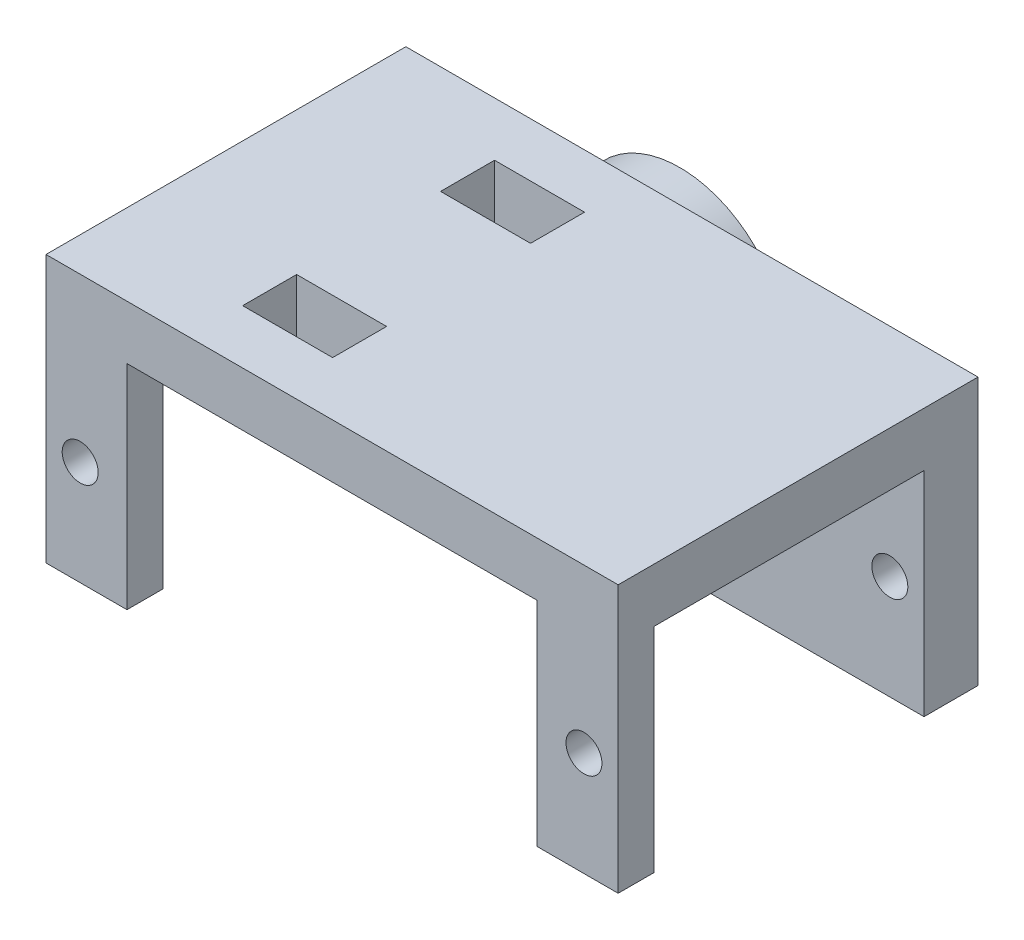
ISO-10303-21;
HEADER;
FILE_DESCRIPTION(('STEP AP214'),'2;1');
FILE_NAME('part.step','',(''),(''),'','','');
FILE_SCHEMA(('AUTOMOTIVE_DESIGN { 1 0 10303 214 1 1 1 1 }'));
ENDSEC;
DATA;
#1=APPLICATION_CONTEXT('core data for automotive mechanical design processes');
#2=APPLICATION_PROTOCOL_DEFINITION('international standard','automotive_design',2000,#1);
#3=PRODUCT_CONTEXT('',#1,'mechanical');
#4=PRODUCT('Part','Part','',(#3));
#5=PRODUCT_RELATED_PRODUCT_CATEGORY('part','',(#4));
#6=PRODUCT_DEFINITION_FORMATION('','',#4);
#7=PRODUCT_DEFINITION_CONTEXT('part definition',#1,'design');
#8=PRODUCT_DEFINITION('design','',#6,#7);
#9=PRODUCT_DEFINITION_SHAPE('','',#8);
#10=(LENGTH_UNIT() NAMED_UNIT(*) SI_UNIT(.MILLI.,.METRE.));
#11=(NAMED_UNIT(*) PLANE_ANGLE_UNIT() SI_UNIT($,.RADIAN.));
#12=(NAMED_UNIT(*) SI_UNIT($,.STERADIAN.) SOLID_ANGLE_UNIT());
#13=UNCERTAINTY_MEASURE_WITH_UNIT(LENGTH_MEASURE(1.E-05),#10,'distance_accuracy_value','');
#14=(GEOMETRIC_REPRESENTATION_CONTEXT(3) GLOBAL_UNCERTAINTY_ASSIGNED_CONTEXT((#13)) GLOBAL_UNIT_ASSIGNED_CONTEXT((#10,
#11,#12)) REPRESENTATION_CONTEXT('',''));
#15=CARTESIAN_POINT('',(0.,0.,0.));
#16=DIRECTION('',(0.,0.,1.));
#17=DIRECTION('',(1.,0.,0.));
#18=AXIS2_PLACEMENT_3D('',#15,#16,#17);
#19=CARTESIAN_POINT('',(14.,0.574999999999999,-18.4));
#20=DIRECTION('',(0.,0.,1.));
#21=DIRECTION('',(1.,0.,0.));
#22=AXIS2_PLACEMENT_3D('',#19,#20,#21);
#23=CYLINDRICAL_SURFACE('',#22,1.);
#24=CARTESIAN_POINT('',(14.,0.574999999999999,-15.4));
#25=DIRECTION('',(0.,0.,1.));
#26=DIRECTION('',(1.,0.,0.));
#27=AXIS2_PLACEMENT_3D('',#24,#25,#26);
#28=CIRCLE('',#27,1.);
#29=CARTESIAN_POINT('',(15.,0.574999999999999,-15.4));
#30=VERTEX_POINT('',#29);
#31=EDGE_CURVE('E265',#30,#30,#28,.T.);
#32=ORIENTED_EDGE('',*,*,#31,.T.);
#33=EDGE_LOOP('',(#32));
#34=FACE_BOUND('',#33,.T.);
#35=CARTESIAN_POINT('',(14.,0.574999999999999,-18.4));
#36=DIRECTION('',(0.,0.,1.));
#37=DIRECTION('',(-1.,0.,0.));
#38=AXIS2_PLACEMENT_3D('',#35,#36,#37);
#39=CIRCLE('',#38,1.);
#40=CARTESIAN_POINT('',(13.,0.574999999999999,-18.4));
#41=VERTEX_POINT('',#40);
#42=EDGE_CURVE('E258',#41,#41,#39,.T.);
#43=ORIENTED_EDGE('',*,*,#42,.F.);
#44=EDGE_LOOP('',(#43));
#45=FACE_BOUND('',#44,.T.);
#46=ADVANCED_FACE('F36',(#34,#45),#23,.F.);
#47=CARTESIAN_POINT('',(11.4,0.,0.));
#48=DIRECTION('',(1.,0.,0.));
#49=DIRECTION('',(0.,0.,-1.));
#50=AXIS2_PLACEMENT_3D('',#47,#48,#49);
#51=PLANE('',#50);
#52=DIRECTION('',(0.,-1.,0.));
#53=VECTOR('',#52,1.);
#54=CARTESIAN_POINT('',(11.4,0.,-0.4));
#55=LINE('',#54,#53);
#56=CARTESIAN_POINT('',(11.4,6.625,-0.400000000000001));
#57=VERTEX_POINT('',#56);
#58=CARTESIAN_POINT('',(11.4,-5.225,-0.4));
#59=VERTEX_POINT('',#58);
#60=EDGE_CURVE('E313',#57,#59,#55,.T.);
#61=ORIENTED_EDGE('',*,*,#60,.T.);
#62=DIRECTION('',(0.,0.,1.));
#63=VECTOR('',#62,1.);
#64=CARTESIAN_POINT('',(11.4,-5.225,0.));
#65=LINE('',#64,#63);
#66=CARTESIAN_POINT('',(11.4,-5.225,1.6));
#67=VERTEX_POINT('',#66);
#68=EDGE_CURVE('E277',#59,#67,#65,.T.);
#69=ORIENTED_EDGE('',*,*,#68,.T.);
#70=DIRECTION('',(0.,1.,0.));
#71=VECTOR('',#70,1.);
#72=CARTESIAN_POINT('',(11.4,0.,1.6));
#73=LINE('',#72,#71);
#74=CARTESIAN_POINT('',(11.4,6.625,1.6));
#75=VERTEX_POINT('',#74);
#76=EDGE_CURVE('E303',#67,#75,#73,.T.);
#77=ORIENTED_EDGE('',*,*,#76,.T.);
#78=DIRECTION('',(0.,0.,1.));
#79=VECTOR('',#78,1.);
#80=CARTESIAN_POINT('',(11.4,6.625,0.));
#81=LINE('',#80,#79);
#82=EDGE_CURVE('E331',#57,#75,#81,.T.);
#83=ORIENTED_EDGE('',*,*,#82,.F.);
#84=EDGE_LOOP('',(#61,#69,#77,#83));
#85=FACE_BOUND('',#84,.T.);
#86=ADVANCED_FACE('F416',(#85),#51,.F.);
#87=CARTESIAN_POINT('',(-15.9,6.625,-21.));
#88=DIRECTION('',(0.,-1.,0.));
#89=DIRECTION('',(0.,0.,-1.));
#90=AXIS2_PLACEMENT_3D('',#87,#88,#89);
#91=PLANE('',#90);
#92=DIRECTION('',(0.,0.,1.));
#93=VECTOR('',#92,1.);
#94=CARTESIAN_POINT('',(-2.97000000000001,6.625,-15.4));
#95=LINE('',#94,#93);
#96=CARTESIAN_POINT('',(-2.97000000000001,6.625,-15.4));
#97=VERTEX_POINT('',#96);
#98=CARTESIAN_POINT('',(-2.97000000000001,6.625,-12.4));
#99=VERTEX_POINT('',#98);
#100=EDGE_CURVE('E187',#97,#99,#95,.T.);
#101=ORIENTED_EDGE('',*,*,#100,.F.);
#102=DIRECTION('',(-1.,0.,0.));
#103=VECTOR('',#102,1.);
#104=CARTESIAN_POINT('',(0.,6.625,-15.4));
#105=LINE('',#104,#103);
#106=CARTESIAN_POINT('',(15.9,6.625,-15.4));
#107=VERTEX_POINT('',#106);
#108=EDGE_CURVE('E329',#107,#97,#105,.T.);
#109=ORIENTED_EDGE('',*,*,#108,.F.);
#110=DIRECTION('',(0.,0.,1.));
#111=VECTOR('',#110,1.);
#112=CARTESIAN_POINT('',(15.9,6.625,-21.));
#113=LINE('',#112,#111);
#114=CARTESIAN_POINT('',(15.9,6.625,-0.400000000000001));
#115=VERTEX_POINT('',#114);
#116=EDGE_CURVE('E344',#107,#115,#113,.T.);
#117=ORIENTED_EDGE('',*,*,#116,.T.);
#118=DIRECTION('',(-1.,0.,0.));
#119=VECTOR('',#118,1.);
#120=CARTESIAN_POINT('',(84.1,6.625,-0.400000000000001));
#121=LINE('',#120,#119);
#122=EDGE_CURVE('E294',#115,#57,#121,.T.);
#123=ORIENTED_EDGE('',*,*,#122,.T.);
#124=ORIENTED_EDGE('',*,*,#82,.T.);
#125=DIRECTION('',(1.,0.,0.));
#126=VECTOR('',#125,1.);
#127=CARTESIAN_POINT('',(-15.9,6.625,1.6));
#128=LINE('',#127,#126);
#129=CARTESIAN_POINT('',(-11.4,6.625,1.6));
#130=VERTEX_POINT('',#129);
#131=EDGE_CURVE('E300',#130,#75,#128,.T.);
#132=ORIENTED_EDGE('',*,*,#131,.F.);
#133=DIRECTION('',(0.,0.,1.));
#134=VECTOR('',#133,1.);
#135=CARTESIAN_POINT('',(-11.4,6.625,0.));
#136=LINE('',#135,#134);
#137=CARTESIAN_POINT('',(-11.4,6.625,-0.400000000000001));
#138=VERTEX_POINT('',#137);
#139=EDGE_CURVE('E332',#138,#130,#136,.T.);
#140=ORIENTED_EDGE('',*,*,#139,.F.);
#141=CARTESIAN_POINT('',(-15.9,6.625,-0.400000000000001));
#142=VERTEX_POINT('',#141);
#143=EDGE_CURVE('E290',#138,#142,#121,.T.);
#144=ORIENTED_EDGE('',*,*,#143,.T.);
#145=DIRECTION('',(0.,0.,1.));
#146=VECTOR('',#145,1.);
#147=CARTESIAN_POINT('',(-15.9,6.625,-21.));
#148=LINE('',#147,#146);
#149=CARTESIAN_POINT('',(-15.9,6.625,-15.4));
#150=VERTEX_POINT('',#149);
#151=EDGE_CURVE('E335',#150,#142,#148,.T.);
#152=ORIENTED_EDGE('',*,*,#151,.F.);
#153=CARTESIAN_POINT('',(-7.97000000000001,6.625,-15.4));
#154=VERTEX_POINT('',#153);
#155=EDGE_CURVE('E328',#154,#150,#105,.T.);
#156=ORIENTED_EDGE('',*,*,#155,.F.);
#157=DIRECTION('',(0.,0.,-1.));
#158=VECTOR('',#157,1.);
#159=CARTESIAN_POINT('',(-7.97000000000001,6.625,-15.4));
#160=LINE('',#159,#158);
#161=CARTESIAN_POINT('',(-7.97000000000001,6.625,-12.4));
#162=VERTEX_POINT('',#161);
#163=EDGE_CURVE('E184',#162,#154,#160,.T.);
#164=ORIENTED_EDGE('',*,*,#163,.F.);
#165=DIRECTION('',(-1.,0.,0.));
#166=VECTOR('',#165,1.);
#167=CARTESIAN_POINT('',(-7.97000000000001,6.625,-12.4));
#168=LINE('',#167,#166);
#169=EDGE_CURVE('E178',#99,#162,#168,.T.);
#170=ORIENTED_EDGE('',*,*,#169,.F.);
#171=EDGE_LOOP('',(#101,#109,#117,#123,#124,#132,#140,#144,#152,#156,#164,#170));
#172=FACE_BOUND('',#171,.T.);
#173=DIRECTION('',(0.,0.,1.));
#174=VECTOR('',#173,1.);
#175=CARTESIAN_POINT('',(-2.97,6.625,-4.4));
#176=LINE('',#175,#174);
#177=CARTESIAN_POINT('',(-2.97,6.625,-4.4));
#178=VERTEX_POINT('',#177);
#179=CARTESIAN_POINT('',(-2.97,6.625,-1.4));
#180=VERTEX_POINT('',#179);
#181=EDGE_CURVE('E51',#178,#180,#176,.T.);
#182=ORIENTED_EDGE('',*,*,#181,.F.);
#183=DIRECTION('',(1.,0.,0.));
#184=VECTOR('',#183,1.);
#185=CARTESIAN_POINT('',(-7.97000000000001,6.625,-4.4));
#186=LINE('',#185,#184);
#187=CARTESIAN_POINT('',(-7.97000000000001,6.625,-4.4));
#188=VERTEX_POINT('',#187);
#189=EDGE_CURVE('E215',#188,#178,#186,.T.);
#190=ORIENTED_EDGE('',*,*,#189,.F.);
#191=DIRECTION('',(0.,0.,-1.));
#192=VECTOR('',#191,1.);
#193=CARTESIAN_POINT('',(-7.97000000000001,6.625,-4.4));
#194=LINE('',#193,#192);
#195=CARTESIAN_POINT('',(-7.97000000000001,6.625,-1.4));
#196=VERTEX_POINT('',#195);
#197=EDGE_CURVE('E212',#196,#188,#194,.T.);
#198=ORIENTED_EDGE('',*,*,#197,.F.);
#199=DIRECTION('',(-1.,0.,0.));
#200=VECTOR('',#199,1.);
#201=CARTESIAN_POINT('',(-7.97000000000001,6.625,-1.4));
#202=LINE('',#201,#200);
#203=EDGE_CURVE('E209',#180,#196,#202,.T.);
#204=ORIENTED_EDGE('',*,*,#203,.F.);
#205=EDGE_LOOP('',(#182,#190,#198,#204));
#206=FACE_BOUND('',#205,.T.);
#207=ADVANCED_FACE('F196',(#172,#206),#91,.T.);
#208=CARTESIAN_POINT('',(-15.9,-6.625,3.));
#209=DIRECTION('',(1.,0.,0.));
#210=DIRECTION('',(0.,0.,-1.));
#211=AXIS2_PLACEMENT_3D('',#208,#209,#210);
#212=PLANE('',#211);
#213=DIRECTION('',(0.,1.,0.));
#214=VECTOR('',#213,1.);
#215=CARTESIAN_POINT('',(-15.9,-39.8161959700948,-18.4));
#216=LINE('',#215,#214);
#217=CARTESIAN_POINT('',(-15.9,-5.225,-18.4));
#218=VERTEX_POINT('',#217);
#219=CARTESIAN_POINT('',(-15.9,9.625,-18.4));
#220=VERTEX_POINT('',#219);
#221=EDGE_CURVE('E320',#218,#220,#216,.T.);
#222=ORIENTED_EDGE('',*,*,#221,.F.);
#223=DIRECTION('',(0.,0.,1.));
#224=VECTOR('',#223,1.);
#225=CARTESIAN_POINT('',(-15.9,-5.225,-18.4));
#226=LINE('',#225,#224);
#227=CARTESIAN_POINT('',(-15.9,-5.225,-15.4));
#228=VERTEX_POINT('',#227);
#229=EDGE_CURVE('E246',#218,#228,#226,.T.);
#230=ORIENTED_EDGE('',*,*,#229,.T.);
#231=DIRECTION('',(0.,1.,0.));
#232=VECTOR('',#231,1.);
#233=CARTESIAN_POINT('',(-15.9,-39.8161959700948,-15.4));
#234=LINE('',#233,#232);
#235=EDGE_CURVE('E322',#228,#150,#234,.T.);
#236=ORIENTED_EDGE('',*,*,#235,.T.);
#237=ORIENTED_EDGE('',*,*,#151,.T.);
#238=DIRECTION('',(0.,1.,0.));
#239=VECTOR('',#238,1.);
#240=CARTESIAN_POINT('',(-15.9,6.625,-0.400000000000001));
#241=LINE('',#240,#239);
#242=CARTESIAN_POINT('',(-15.9,-5.225,-0.400000000000001));
#243=VERTEX_POINT('',#242);
#244=EDGE_CURVE('E288',#243,#142,#241,.T.);
#245=ORIENTED_EDGE('',*,*,#244,.F.);
#246=CARTESIAN_POINT('',(-15.9,-5.225,1.6));
#247=VERTEX_POINT('',#246);
#248=EDGE_CURVE('E250',#243,#247,#226,.T.);
#249=ORIENTED_EDGE('',*,*,#248,.T.);
#250=DIRECTION('',(0.,-1.,0.));
#251=VECTOR('',#250,1.);
#252=CARTESIAN_POINT('',(-15.9,9.625,1.6));
#253=LINE('',#252,#251);
#254=CARTESIAN_POINT('',(-15.9,9.625,1.6));
#255=VERTEX_POINT('',#254);
#256=EDGE_CURVE('E287',#255,#247,#253,.T.);
#257=ORIENTED_EDGE('',*,*,#256,.F.);
#258=DIRECTION('',(0.,0.,1.));
#259=VECTOR('',#258,1.);
#260=CARTESIAN_POINT('',(-15.9,9.625,-21.));
#261=LINE('',#260,#259);
#262=EDGE_CURVE('E338',#220,#255,#261,.T.);
#263=ORIENTED_EDGE('',*,*,#262,.F.);
#264=EDGE_LOOP('',(#222,#230,#236,#237,#245,#249,#257,#263));
#265=FACE_BOUND('',#264,.T.);
#266=ADVANCED_FACE('F38',(#265),#212,.F.);
#267=CARTESIAN_POINT('',(15.9,-6.625,3.));
#268=DIRECTION('',(-1.,0.,0.));
#269=DIRECTION('',(0.,0.,1.));
#270=AXIS2_PLACEMENT_3D('',#267,#268,#269);
#271=PLANE('',#270);
#272=DIRECTION('',(0.,-1.,0.));
#273=VECTOR('',#272,1.);
#274=CARTESIAN_POINT('',(15.9,-6.625,1.6));
#275=LINE('',#274,#273);
#276=CARTESIAN_POINT('',(15.9,9.625,1.6));
#277=VERTEX_POINT('',#276);
#278=CARTESIAN_POINT('',(15.9,-5.225,1.6));
#279=VERTEX_POINT('',#278);
#280=EDGE_CURVE('E305',#277,#279,#275,.T.);
#281=ORIENTED_EDGE('',*,*,#280,.T.);
#282=DIRECTION('',(0.,0.,1.));
#283=VECTOR('',#282,1.);
#284=CARTESIAN_POINT('',(15.9,-5.225,-18.4));
#285=LINE('',#284,#283);
#286=CARTESIAN_POINT('',(15.9,-5.225,-0.400000000000001));
#287=VERTEX_POINT('',#286);
#288=EDGE_CURVE('E241',#287,#279,#285,.T.);
#289=ORIENTED_EDGE('',*,*,#288,.F.);
#290=DIRECTION('',(0.,1.,0.));
#291=VECTOR('',#290,1.);
#292=CARTESIAN_POINT('',(15.9,-6.625,-0.399999999999999));
#293=LINE('',#292,#291);
#294=EDGE_CURVE('E311',#287,#115,#293,.T.);
#295=ORIENTED_EDGE('',*,*,#294,.T.);
#296=ORIENTED_EDGE('',*,*,#116,.F.);
#297=DIRECTION('',(0.,1.,0.));
#298=VECTOR('',#297,1.);
#299=CARTESIAN_POINT('',(15.9,-39.8161959700948,-15.4));
#300=LINE('',#299,#298);
#301=CARTESIAN_POINT('',(15.9,-5.225,-15.4));
#302=VERTEX_POINT('',#301);
#303=EDGE_CURVE('E319',#302,#107,#300,.T.);
#304=ORIENTED_EDGE('',*,*,#303,.F.);
#305=CARTESIAN_POINT('',(15.9,-5.225,-18.4));
#306=VERTEX_POINT('',#305);
#307=EDGE_CURVE('E251',#306,#302,#285,.T.);
#308=ORIENTED_EDGE('',*,*,#307,.F.);
#309=DIRECTION('',(0.,1.,0.));
#310=VECTOR('',#309,1.);
#311=CARTESIAN_POINT('',(15.9,-39.8161959700948,-18.4));
#312=LINE('',#311,#310);
#313=CARTESIAN_POINT('',(15.9,9.625,-18.4));
#314=VERTEX_POINT('',#313);
#315=EDGE_CURVE('E323',#306,#314,#312,.T.);
#316=ORIENTED_EDGE('',*,*,#315,.T.);
#317=DIRECTION('',(0.,0.,1.));
#318=VECTOR('',#317,1.);
#319=CARTESIAN_POINT('',(15.9,9.625,-21.));
#320=LINE('',#319,#318);
#321=EDGE_CURVE('E341',#314,#277,#320,.T.);
#322=ORIENTED_EDGE('',*,*,#321,.T.);
#323=EDGE_LOOP('',(#281,#289,#295,#296,#304,#308,#316,#322));
#324=FACE_BOUND('',#323,.T.);
#325=ADVANCED_FACE('F375',(#324),#271,.F.);
#326=CARTESIAN_POINT('',(-15.9,9.625,-21.));
#327=DIRECTION('',(0.,1.,0.));
#328=DIRECTION('',(0.,0.,1.));
#329=AXIS2_PLACEMENT_3D('',#326,#327,#328);
#330=PLANE('',#329);
#331=DIRECTION('',(0.,0.,-1.));
#332=VECTOR('',#331,1.);
#333=CARTESIAN_POINT('',(-2.97000000000001,9.625,-21.));
#334=LINE('',#333,#332);
#335=CARTESIAN_POINT('',(-2.97000000000001,9.625,-12.4));
#336=VERTEX_POINT('',#335);
#337=CARTESIAN_POINT('',(-2.97000000000001,9.625,-15.4));
#338=VERTEX_POINT('',#337);
#339=EDGE_CURVE('E11',#336,#338,#334,.T.);
#340=ORIENTED_EDGE('',*,*,#339,.F.);
#341=DIRECTION('',(1.,0.,0.));
#342=VECTOR('',#341,1.);
#343=CARTESIAN_POINT('',(-15.9,9.625,-12.4));
#344=LINE('',#343,#342);
#345=CARTESIAN_POINT('',(-7.97000000000001,9.625,-12.4));
#346=VERTEX_POINT('',#345);
#347=EDGE_CURVE('E181',#346,#336,#344,.T.);
#348=ORIENTED_EDGE('',*,*,#347,.F.);
#349=DIRECTION('',(0.,0.,1.));
#350=VECTOR('',#349,1.);
#351=CARTESIAN_POINT('',(-7.97000000000001,9.625,-21.));
#352=LINE('',#351,#350);
#353=CARTESIAN_POINT('',(-7.97000000000001,9.625,-15.4));
#354=VERTEX_POINT('',#353);
#355=EDGE_CURVE('E360',#354,#346,#352,.T.);
#356=ORIENTED_EDGE('',*,*,#355,.F.);
#357=DIRECTION('',(-1.,0.,0.));
#358=VECTOR('',#357,1.);
#359=CARTESIAN_POINT('',(-15.9,9.625,-15.4));
#360=LINE('',#359,#358);
#361=EDGE_CURVE('E44',#338,#354,#360,.T.);
#362=ORIENTED_EDGE('',*,*,#361,.F.);
#363=EDGE_LOOP('',(#340,#348,#356,#362));
#364=FACE_BOUND('',#363,.T.);
#365=DIRECTION('',(0.,0.,-1.));
#366=VECTOR('',#365,1.);
#367=CARTESIAN_POINT('',(-2.97,9.625,-21.));
#368=LINE('',#367,#366);
#369=CARTESIAN_POINT('',(-2.97,9.625,-1.4));
#370=VERTEX_POINT('',#369);
#371=CARTESIAN_POINT('',(-2.97,9.625,-4.4));
#372=VERTEX_POINT('',#371);
#373=EDGE_CURVE('E357',#370,#372,#368,.T.);
#374=ORIENTED_EDGE('',*,*,#373,.F.);
#375=DIRECTION('',(1.,0.,0.));
#376=VECTOR('',#375,1.);
#377=CARTESIAN_POINT('',(-15.9,9.625,-1.4));
#378=LINE('',#377,#376);
#379=CARTESIAN_POINT('',(-7.97000000000001,9.625,-1.4));
#380=VERTEX_POINT('',#379);
#381=EDGE_CURVE('E231',#380,#370,#378,.T.);
#382=ORIENTED_EDGE('',*,*,#381,.F.);
#383=DIRECTION('',(0.,0.,1.));
#384=VECTOR('',#383,1.);
#385=CARTESIAN_POINT('',(-7.97000000000001,9.625,-21.));
#386=LINE('',#385,#384);
#387=CARTESIAN_POINT('',(-7.97000000000001,9.625,-4.4));
#388=VERTEX_POINT('',#387);
#389=EDGE_CURVE('E352',#388,#380,#386,.T.);
#390=ORIENTED_EDGE('',*,*,#389,.F.);
#391=DIRECTION('',(-1.,0.,0.));
#392=VECTOR('',#391,1.);
#393=CARTESIAN_POINT('',(-15.9,9.625,-4.4));
#394=LINE('',#393,#392);
#395=EDGE_CURVE('E355',#372,#388,#394,.T.);
#396=ORIENTED_EDGE('',*,*,#395,.F.);
#397=EDGE_LOOP('',(#374,#382,#390,#396));
#398=FACE_BOUND('',#397,.T.);
#399=DIRECTION('',(-1.,0.,0.));
#400=VECTOR('',#399,1.);
#401=CARTESIAN_POINT('',(84.1,9.625,1.6));
#402=LINE('',#401,#400);
#403=EDGE_CURVE('E291',#277,#255,#402,.T.);
#404=ORIENTED_EDGE('',*,*,#403,.F.);
#405=ORIENTED_EDGE('',*,*,#321,.F.);
#406=DIRECTION('',(-1.,0.,0.));
#407=VECTOR('',#406,1.);
#408=CARTESIAN_POINT('',(-15.9,9.625,-18.4));
#409=LINE('',#408,#407);
#410=EDGE_CURVE('E316',#314,#220,#409,.T.);
#411=ORIENTED_EDGE('',*,*,#410,.T.);
#412=ORIENTED_EDGE('',*,*,#262,.T.);
#413=EDGE_LOOP('',(#404,#405,#411,#412));
#414=FACE_BOUND('',#413,.T.);
#415=ADVANCED_FACE('F371',(#364,#398,#414),#330,.T.);
#416=CARTESIAN_POINT('',(-11.4,0.,0.));
#417=DIRECTION('',(1.,0.,0.));
#418=DIRECTION('',(0.,0.,-1.));
#419=AXIS2_PLACEMENT_3D('',#416,#417,#418);
#420=PLANE('',#419);
#421=DIRECTION('',(0.,0.,1.));
#422=VECTOR('',#421,1.);
#423=CARTESIAN_POINT('',(-11.4,-5.225,0.));
#424=LINE('',#423,#422);
#425=CARTESIAN_POINT('',(-11.4,-5.225,-0.4));
#426=VERTEX_POINT('',#425);
#427=CARTESIAN_POINT('',(-11.4,-5.225,1.6));
#428=VERTEX_POINT('',#427);
#429=EDGE_CURVE('E283',#426,#428,#424,.T.);
#430=ORIENTED_EDGE('',*,*,#429,.F.);
#431=DIRECTION('',(0.,-1.,0.));
#432=VECTOR('',#431,1.);
#433=CARTESIAN_POINT('',(-11.4,0.,-0.4));
#434=LINE('',#433,#432);
#435=EDGE_CURVE('E308',#138,#426,#434,.T.);
#436=ORIENTED_EDGE('',*,*,#435,.F.);
#437=ORIENTED_EDGE('',*,*,#139,.T.);
#438=DIRECTION('',(0.,1.,0.));
#439=VECTOR('',#438,1.);
#440=CARTESIAN_POINT('',(-11.4,0.,1.6));
#441=LINE('',#440,#439);
#442=EDGE_CURVE('E298',#428,#130,#441,.T.);
#443=ORIENTED_EDGE('',*,*,#442,.F.);
#444=EDGE_LOOP('',(#430,#436,#437,#443));
#445=FACE_BOUND('',#444,.T.);
#446=ADVANCED_FACE('F374',(#445),#420,.T.);
#447=CARTESIAN_POINT('',(-15.9,-39.8161959700948,-15.4));
#448=DIRECTION('',(0.,0.,1.));
#449=DIRECTION('',(1.,0.,0.));
#450=AXIS2_PLACEMENT_3D('',#447,#448,#449);
#451=PLANE('',#450);
#452=DIRECTION('',(-1.,0.,0.));
#453=VECTOR('',#452,1.);
#454=CARTESIAN_POINT('',(-15.9,-5.225,-15.4));
#455=LINE('',#454,#453);
#456=EDGE_CURVE('E285',#302,#228,#455,.T.);
#457=ORIENTED_EDGE('',*,*,#456,.F.);
#458=ORIENTED_EDGE('',*,*,#303,.T.);
#459=ORIENTED_EDGE('',*,*,#108,.T.);
#460=DIRECTION('',(0.,-1.,0.));
#461=VECTOR('',#460,1.);
#462=CARTESIAN_POINT('',(-2.97000000000001,16.625,-15.4));
#463=LINE('',#462,#461);
#464=EDGE_CURVE('E190',#338,#97,#463,.T.);
#465=ORIENTED_EDGE('',*,*,#464,.F.);
#466=ORIENTED_EDGE('',*,*,#361,.T.);
#467=DIRECTION('',(0.,-1.,0.));
#468=VECTOR('',#467,1.);
#469=CARTESIAN_POINT('',(-7.97000000000001,16.625,-15.4));
#470=LINE('',#469,#468);
#471=EDGE_CURVE('E204',#354,#154,#470,.T.);
#472=ORIENTED_EDGE('',*,*,#471,.T.);
#473=ORIENTED_EDGE('',*,*,#155,.T.);
#474=ORIENTED_EDGE('',*,*,#235,.F.);
#475=EDGE_LOOP('',(#457,#458,#459,#465,#466,#472,#473,#474));
#476=FACE_BOUND('',#475,.T.);
#477=CARTESIAN_POINT('',(-14.,0.574999999999999,-15.4));
#478=DIRECTION('',(0.,0.,1.));
#479=DIRECTION('',(1.,0.,0.));
#480=AXIS2_PLACEMENT_3D('',#477,#478,#479);
#481=CIRCLE('',#480,1.);
#482=CARTESIAN_POINT('',(-13.,0.574999999999999,-15.4));
#483=VERTEX_POINT('',#482);
#484=EDGE_CURVE('E271',#483,#483,#481,.T.);
#485=ORIENTED_EDGE('',*,*,#484,.F.);
#486=EDGE_LOOP('',(#485));
#487=FACE_BOUND('',#486,.T.);
#488=ORIENTED_EDGE('',*,*,#31,.F.);
#489=EDGE_LOOP('',(#488));
#490=FACE_BOUND('',#489,.T.);
#491=ADVANCED_FACE('F365',(#476,#487,#490),#451,.T.);
#492=CARTESIAN_POINT('',(-15.9,-39.8161959700948,-18.4));
#493=DIRECTION('',(0.,0.,-1.));
#494=DIRECTION('',(-1.,0.,0.));
#495=AXIS2_PLACEMENT_3D('',#492,#493,#494);
#496=PLANE('',#495);
#497=DIRECTION('',(-1.,0.,0.));
#498=VECTOR('',#497,1.);
#499=CARTESIAN_POINT('',(-15.9,-5.225,-18.4));
#500=LINE('',#499,#498);
#501=CARTESIAN_POINT('',(-5.47000000000001,-5.225,-18.4));
#502=VERTEX_POINT('',#501);
#503=EDGE_CURVE('E239',#306,#502,#500,.T.);
#504=ORIENTED_EDGE('',*,*,#503,.T.);
#505=CARTESIAN_POINT('',(-5.47000000000001,0.699999999999999,-18.4));
#506=DIRECTION('',(0.,0.,-1.));
#507=DIRECTION('',(-1.,0.,0.));
#508=AXIS2_PLACEMENT_3D('',#505,#506,#507);
#509=CIRCLE('',#508,5.925);
#510=EDGE_CURVE('E227',#502,#502,#509,.T.);
#511=ORIENTED_EDGE('',*,*,#510,.F.);
#512=EDGE_CURVE('E242',#502,#218,#500,.T.);
#513=ORIENTED_EDGE('',*,*,#512,.T.);
#514=ORIENTED_EDGE('',*,*,#221,.T.);
#515=ORIENTED_EDGE('',*,*,#410,.F.);
#516=ORIENTED_EDGE('',*,*,#315,.F.);
#517=EDGE_LOOP('',(#504,#511,#513,#514,#515,#516));
#518=FACE_BOUND('',#517,.T.);
#519=CARTESIAN_POINT('',(-14.,0.574999999999999,-18.4));
#520=DIRECTION('',(0.,0.,1.));
#521=DIRECTION('',(1.,0.,0.));
#522=AXIS2_PLACEMENT_3D('',#519,#520,#521);
#523=CIRCLE('',#522,1.);
#524=CARTESIAN_POINT('',(-13.,0.574999999999999,-18.4));
#525=VERTEX_POINT('',#524);
#526=EDGE_CURVE('E245',#525,#525,#523,.T.);
#527=ORIENTED_EDGE('',*,*,#526,.T.);
#528=EDGE_LOOP('',(#527));
#529=FACE_BOUND('',#528,.T.);
#530=ORIENTED_EDGE('',*,*,#42,.T.);
#531=EDGE_LOOP('',(#530));
#532=FACE_BOUND('',#531,.T.);
#533=ADVANCED_FACE('F393',(#518,#529,#532),#496,.T.);
#534=CARTESIAN_POINT('',(84.1,6.625,-0.400000000000001));
#535=DIRECTION('',(0.,0.,1.));
#536=DIRECTION('',(0.,-1.,0.));
#537=AXIS2_PLACEMENT_3D('',#534,#535,#536);
#538=PLANE('',#537);
#539=CARTESIAN_POINT('',(-14.,0.574999999999999,-0.400000000000001));
#540=DIRECTION('',(0.,0.,1.));
#541=DIRECTION('',(0.,-1.,0.));
#542=AXIS2_PLACEMENT_3D('',#539,#540,#541);
#543=CIRCLE('',#542,1.);
#544=CARTESIAN_POINT('',(-14.,-0.425,-0.400000000000001));
#545=VERTEX_POINT('',#544);
#546=EDGE_CURVE('E268',#545,#545,#543,.T.);
#547=ORIENTED_EDGE('',*,*,#546,.T.);
#548=EDGE_LOOP('',(#547));
#549=FACE_BOUND('',#548,.T.);
#550=ORIENTED_EDGE('',*,*,#435,.T.);
#551=DIRECTION('',(-1.,0.,0.));
#552=VECTOR('',#551,1.);
#553=CARTESIAN_POINT('',(84.1,-5.225,-0.4));
#554=LINE('',#553,#552);
#555=EDGE_CURVE('E280',#426,#243,#554,.T.);
#556=ORIENTED_EDGE('',*,*,#555,.T.);
#557=ORIENTED_EDGE('',*,*,#244,.T.);
#558=ORIENTED_EDGE('',*,*,#143,.F.);
#559=EDGE_LOOP('',(#550,#556,#557,#558));
#560=FACE_BOUND('',#559,.T.);
#561=ADVANCED_FACE('F428',(#549,#560),#538,.F.);
#562=CARTESIAN_POINT('',(14.,0.574999999999999,-0.400000000000001));
#563=DIRECTION('',(0.,0.,1.));
#564=DIRECTION('',(0.,-1.,0.));
#565=AXIS2_PLACEMENT_3D('',#562,#563,#564);
#566=CIRCLE('',#565,1.);
#567=CARTESIAN_POINT('',(14.,-0.425,-0.400000000000001));
#568=VERTEX_POINT('',#567);
#569=EDGE_CURVE('E249',#568,#568,#566,.T.);
#570=ORIENTED_EDGE('',*,*,#569,.T.);
#571=EDGE_LOOP('',(#570));
#572=FACE_BOUND('',#571,.T.);
#573=ORIENTED_EDGE('',*,*,#294,.F.);
#574=DIRECTION('',(-1.,0.,0.));
#575=VECTOR('',#574,1.);
#576=CARTESIAN_POINT('',(84.1,-5.225,-0.4));
#577=LINE('',#576,#575);
#578=EDGE_CURVE('E274',#287,#59,#577,.T.);
#579=ORIENTED_EDGE('',*,*,#578,.T.);
#580=ORIENTED_EDGE('',*,*,#60,.F.);
#581=ORIENTED_EDGE('',*,*,#122,.F.);
#582=EDGE_LOOP('',(#573,#579,#580,#581));
#583=FACE_BOUND('',#582,.T.);
#584=ADVANCED_FACE('F421',(#572,#583),#538,.F.);
#585=CARTESIAN_POINT('',(84.1,9.625,1.6));
#586=DIRECTION('',(0.,0.,-1.));
#587=DIRECTION('',(0.,1.,0.));
#588=AXIS2_PLACEMENT_3D('',#585,#586,#587);
#589=PLANE('',#588);
#590=CARTESIAN_POINT('',(-14.,0.574999999999999,1.6));
#591=DIRECTION('',(0.,0.,1.));
#592=DIRECTION('',(1.,0.,0.));
#593=AXIS2_PLACEMENT_3D('',#590,#591,#592);
#594=CIRCLE('',#593,1.);
#595=CARTESIAN_POINT('',(-13.,0.574999999999999,1.6));
#596=VERTEX_POINT('',#595);
#597=EDGE_CURVE('E255',#596,#596,#594,.T.);
#598=ORIENTED_EDGE('',*,*,#597,.F.);
#599=EDGE_LOOP('',(#598));
#600=FACE_BOUND('',#599,.T.);
#601=CARTESIAN_POINT('',(14.,0.574999999999999,1.6));
#602=DIRECTION('',(0.,0.,1.));
#603=DIRECTION('',(-1.,0.,0.));
#604=AXIS2_PLACEMENT_3D('',#601,#602,#603);
#605=CIRCLE('',#604,1.);
#606=CARTESIAN_POINT('',(13.,0.574999999999999,1.6));
#607=VERTEX_POINT('',#606);
#608=EDGE_CURVE('E236',#607,#607,#605,.T.);
#609=ORIENTED_EDGE('',*,*,#608,.F.);
#610=EDGE_LOOP('',(#609));
#611=FACE_BOUND('',#610,.T.);
#612=ORIENTED_EDGE('',*,*,#256,.T.);
#613=DIRECTION('',(1.,0.,0.));
#614=VECTOR('',#613,1.);
#615=CARTESIAN_POINT('',(84.1,-5.225,1.6));
#616=LINE('',#615,#614);
#617=EDGE_CURVE('E232',#247,#428,#616,.T.);
#618=ORIENTED_EDGE('',*,*,#617,.T.);
#619=ORIENTED_EDGE('',*,*,#442,.T.);
#620=ORIENTED_EDGE('',*,*,#131,.T.);
#621=ORIENTED_EDGE('',*,*,#76,.F.);
#622=DIRECTION('',(-1.,0.,0.));
#623=VECTOR('',#622,1.);
#624=CARTESIAN_POINT('',(-15.9,-5.225,1.6));
#625=LINE('',#624,#623);
#626=EDGE_CURVE('E243',#279,#67,#625,.T.);
#627=ORIENTED_EDGE('',*,*,#626,.F.);
#628=ORIENTED_EDGE('',*,*,#280,.F.);
#629=ORIENTED_EDGE('',*,*,#403,.T.);
#630=EDGE_LOOP('',(#612,#618,#619,#620,#621,#627,#628,#629));
#631=FACE_BOUND('',#630,.T.);
#632=ADVANCED_FACE('F402',(#600,#611,#631),#589,.F.);
#633=ORIENTED_EDGE('',*,*,#608,.T.);
#634=EDGE_LOOP('',(#633));
#635=FACE_BOUND('',#634,.T.);
#636=ORIENTED_EDGE('',*,*,#569,.F.);
#637=EDGE_LOOP('',(#636));
#638=FACE_BOUND('',#637,.T.);
#639=ADVANCED_FACE('F446',(#635,#638),#23,.F.);
#640=CARTESIAN_POINT('',(-14.,0.574999999999999,-18.4));
#641=DIRECTION('',(0.,0.,1.));
#642=DIRECTION('',(1.,0.,0.));
#643=AXIS2_PLACEMENT_3D('',#640,#641,#642);
#644=CYLINDRICAL_SURFACE('',#643,1.);
#645=ORIENTED_EDGE('',*,*,#597,.T.);
#646=EDGE_LOOP('',(#645));
#647=FACE_BOUND('',#646,.T.);
#648=ORIENTED_EDGE('',*,*,#546,.F.);
#649=EDGE_LOOP('',(#648));
#650=FACE_BOUND('',#649,.T.);
#651=ADVANCED_FACE('F439',(#647,#650),#644,.F.);
#652=CARTESIAN_POINT('',(-15.9,-5.225,-18.4));
#653=DIRECTION('',(0.,1.,0.));
#654=DIRECTION('',(0.,0.,1.));
#655=AXIS2_PLACEMENT_3D('',#652,#653,#654);
#656=PLANE('',#655);
#657=ORIENTED_EDGE('',*,*,#578,.F.);
#658=ORIENTED_EDGE('',*,*,#288,.T.);
#659=ORIENTED_EDGE('',*,*,#626,.T.);
#660=ORIENTED_EDGE('',*,*,#68,.F.);
#661=EDGE_LOOP('',(#657,#658,#659,#660));
#662=FACE_BOUND('',#661,.T.);
#663=ADVANCED_FACE('F418',(#662),#656,.F.);
#664=ORIENTED_EDGE('',*,*,#429,.T.);
#665=ORIENTED_EDGE('',*,*,#617,.F.);
#666=ORIENTED_EDGE('',*,*,#248,.F.);
#667=ORIENTED_EDGE('',*,*,#555,.F.);
#668=EDGE_LOOP('',(#664,#665,#666,#667));
#669=FACE_BOUND('',#668,.T.);
#670=ADVANCED_FACE('F429',(#669),#656,.F.);
#671=ORIENTED_EDGE('',*,*,#484,.T.);
#672=EDGE_LOOP('',(#671));
#673=FACE_BOUND('',#672,.T.);
#674=ORIENTED_EDGE('',*,*,#526,.F.);
#675=EDGE_LOOP('',(#674));
#676=FACE_BOUND('',#675,.T.);
#677=ADVANCED_FACE('F431',(#673,#676),#644,.F.);
#678=ORIENTED_EDGE('',*,*,#456,.T.);
#679=ORIENTED_EDGE('',*,*,#229,.F.);
#680=ORIENTED_EDGE('',*,*,#512,.F.);
#681=ORIENTED_EDGE('',*,*,#503,.F.);
#682=ORIENTED_EDGE('',*,*,#307,.T.);
#683=EDGE_LOOP('',(#678,#679,#680,#681,#682));
#684=FACE_BOUND('',#683,.T.);
#685=ADVANCED_FACE('F426',(#684),#656,.F.);
#686=CARTESIAN_POINT('',(-5.47000000000001,0.699999999999999,-23.2));
#687=DIRECTION('',(0.,0.,1.));
#688=DIRECTION('',(1.,0.,0.));
#689=AXIS2_PLACEMENT_3D('',#686,#687,#688);
#690=CYLINDRICAL_SURFACE('',#689,5.925);
#691=CARTESIAN_POINT('',(-5.47000000000001,0.699999999999999,-23.2));
#692=DIRECTION('',(0.,0.,-1.));
#693=DIRECTION('',(-1.,0.,0.));
#694=AXIS2_PLACEMENT_3D('',#691,#692,#693);
#695=CIRCLE('',#694,5.925);
#696=CARTESIAN_POINT('',(-11.395,0.699999999999999,-23.2));
#697=VERTEX_POINT('',#696);
#698=EDGE_CURVE('E233',#697,#697,#695,.T.);
#699=ORIENTED_EDGE('',*,*,#698,.F.);
#700=EDGE_LOOP('',(#699));
#701=FACE_BOUND('',#700,.T.);
#702=ORIENTED_EDGE('',*,*,#510,.T.);
#703=EDGE_LOOP('',(#702));
#704=FACE_BOUND('',#703,.T.);
#705=ADVANCED_FACE('F442',(#701,#704),#690,.T.);
#706=CARTESIAN_POINT('',(-5.47000000000001,0.699999999999999,-23.2));
#707=DIRECTION('',(0.,0.,-1.));
#708=DIRECTION('',(-1.,0.,0.));
#709=AXIS2_PLACEMENT_3D('',#706,#707,#708);
#710=PLANE('',#709);
#711=CARTESIAN_POINT('',(-5.47000000000001,0.699999999999999,-23.2));
#712=DIRECTION('',(0.,0.,-1.));
#713=DIRECTION('',(-1.,0.,0.));
#714=AXIS2_PLACEMENT_3D('',#711,#712,#713);
#715=CIRCLE('',#714,2.5);
#716=CARTESIAN_POINT('',(-7.97000000000001,0.699999999999999,-23.2));
#717=VERTEX_POINT('',#716);
#718=EDGE_CURVE('E228',#717,#717,#715,.T.);
#719=ORIENTED_EDGE('',*,*,#718,.F.);
#720=EDGE_LOOP('',(#719));
#721=FACE_BOUND('',#720,.T.);
#722=ORIENTED_EDGE('',*,*,#698,.T.);
#723=EDGE_LOOP('',(#722));
#724=FACE_BOUND('',#723,.T.);
#725=ADVANCED_FACE('F550',(#721,#724),#710,.T.);
#726=CARTESIAN_POINT('',(-5.47000000000001,0.699999999999999,-25.2));
#727=DIRECTION('',(0.,0.,1.));
#728=DIRECTION('',(1.,0.,0.));
#729=AXIS2_PLACEMENT_3D('',#726,#727,#728);
#730=CYLINDRICAL_SURFACE('',#729,2.5);
#731=CARTESIAN_POINT('',(-5.47000000000001,0.699999999999999,-25.2));
#732=DIRECTION('',(0.,0.,-1.));
#733=DIRECTION('',(-1.,0.,0.));
#734=AXIS2_PLACEMENT_3D('',#731,#732,#733);
#735=CIRCLE('',#734,2.5);
#736=CARTESIAN_POINT('',(-7.97000000000001,0.699999999999999,-25.2));
#737=VERTEX_POINT('',#736);
#738=EDGE_CURVE('E203',#737,#737,#735,.T.);
#739=ORIENTED_EDGE('',*,*,#738,.F.);
#740=EDGE_LOOP('',(#739));
#741=FACE_BOUND('',#740,.T.);
#742=ORIENTED_EDGE('',*,*,#718,.T.);
#743=EDGE_LOOP('',(#742));
#744=FACE_BOUND('',#743,.T.);
#745=ADVANCED_FACE('F558',(#741,#744),#730,.T.);
#746=CARTESIAN_POINT('',(-5.47000000000001,0.699999999999999,-25.2));
#747=DIRECTION('',(0.,0.,-1.));
#748=DIRECTION('',(-1.,0.,0.));
#749=AXIS2_PLACEMENT_3D('',#746,#747,#748);
#750=PLANE('',#749);
#751=ORIENTED_EDGE('',*,*,#738,.T.);
#752=EDGE_LOOP('',(#751));
#753=FACE_BOUND('',#752,.T.);
#754=ADVANCED_FACE('F567',(#753),#750,.T.);
#755=CARTESIAN_POINT('',(-2.97000000000001,16.625,-15.4));
#756=DIRECTION('',(1.,0.,0.));
#757=DIRECTION('',(0.,0.,-1.));
#758=AXIS2_PLACEMENT_3D('',#755,#756,#757);
#759=PLANE('',#758);
#760=ORIENTED_EDGE('',*,*,#339,.T.);
#761=ORIENTED_EDGE('',*,*,#464,.T.);
#762=ORIENTED_EDGE('',*,*,#100,.T.);
#763=DIRECTION('',(0.,-1.,0.));
#764=VECTOR('',#763,1.);
#765=CARTESIAN_POINT('',(-2.97000000000001,16.625,-12.4));
#766=LINE('',#765,#764);
#767=EDGE_CURVE('E174',#336,#99,#766,.T.);
#768=ORIENTED_EDGE('',*,*,#767,.F.);
#769=EDGE_LOOP('',(#760,#761,#762,#768));
#770=FACE_BOUND('',#769,.T.);
#771=ADVANCED_FACE('F188',(#770),#759,.F.);
#772=CARTESIAN_POINT('',(-7.97000000000001,16.625,-15.4));
#773=DIRECTION('',(-1.,0.,0.));
#774=DIRECTION('',(0.,0.,1.));
#775=AXIS2_PLACEMENT_3D('',#772,#773,#774);
#776=PLANE('',#775);
#777=ORIENTED_EDGE('',*,*,#355,.T.);
#778=DIRECTION('',(0.,-1.,0.));
#779=VECTOR('',#778,1.);
#780=CARTESIAN_POINT('',(-7.97000000000001,16.625,-12.4));
#781=LINE('',#780,#779);
#782=EDGE_CURVE('E59',#346,#162,#781,.T.);
#783=ORIENTED_EDGE('',*,*,#782,.T.);
#784=ORIENTED_EDGE('',*,*,#163,.T.);
#785=ORIENTED_EDGE('',*,*,#471,.F.);
#786=EDGE_LOOP('',(#777,#783,#784,#785));
#787=FACE_BOUND('',#786,.T.);
#788=ADVANCED_FACE('F370',(#787),#776,.F.);
#789=CARTESIAN_POINT('',(-7.97000000000001,16.625,-12.4));
#790=DIRECTION('',(0.,0.,1.));
#791=DIRECTION('',(1.,0.,0.));
#792=AXIS2_PLACEMENT_3D('',#789,#790,#791);
#793=PLANE('',#792);
#794=ORIENTED_EDGE('',*,*,#347,.T.);
#795=ORIENTED_EDGE('',*,*,#767,.T.);
#796=ORIENTED_EDGE('',*,*,#169,.T.);
#797=ORIENTED_EDGE('',*,*,#782,.F.);
#798=EDGE_LOOP('',(#794,#795,#796,#797));
#799=FACE_BOUND('',#798,.T.);
#800=ADVANCED_FACE('F176',(#799),#793,.F.);
#801=CARTESIAN_POINT('',(-2.97,16.625,-4.4));
#802=DIRECTION('',(1.,0.,0.));
#803=DIRECTION('',(0.,0.,-1.));
#804=AXIS2_PLACEMENT_3D('',#801,#802,#803);
#805=PLANE('',#804);
#806=ORIENTED_EDGE('',*,*,#373,.T.);
#807=DIRECTION('',(0.,-1.,0.));
#808=VECTOR('',#807,1.);
#809=CARTESIAN_POINT('',(-2.97,16.625,-4.4));
#810=LINE('',#809,#808);
#811=EDGE_CURVE('E194',#372,#178,#810,.T.);
#812=ORIENTED_EDGE('',*,*,#811,.T.);
#813=ORIENTED_EDGE('',*,*,#181,.T.);
#814=DIRECTION('',(0.,-1.,0.));
#815=VECTOR('',#814,1.);
#816=CARTESIAN_POINT('',(-2.97,16.625,-1.4));
#817=LINE('',#816,#815);
#818=EDGE_CURVE('E218',#370,#180,#817,.T.);
#819=ORIENTED_EDGE('',*,*,#818,.F.);
#820=EDGE_LOOP('',(#806,#812,#813,#819));
#821=FACE_BOUND('',#820,.T.);
#822=ADVANCED_FACE('F606',(#821),#805,.F.);
#823=CARTESIAN_POINT('',(-7.97000000000001,16.625,-4.4));
#824=DIRECTION('',(0.,0.,-1.));
#825=DIRECTION('',(-1.,0.,0.));
#826=AXIS2_PLACEMENT_3D('',#823,#824,#825);
#827=PLANE('',#826);
#828=ORIENTED_EDGE('',*,*,#395,.T.);
#829=DIRECTION('',(0.,-1.,0.));
#830=VECTOR('',#829,1.);
#831=CARTESIAN_POINT('',(-7.97000000000001,16.625,-4.4));
#832=LINE('',#831,#830);
#833=EDGE_CURVE('E220',#388,#188,#832,.T.);
#834=ORIENTED_EDGE('',*,*,#833,.T.);
#835=ORIENTED_EDGE('',*,*,#189,.T.);
#836=ORIENTED_EDGE('',*,*,#811,.F.);
#837=EDGE_LOOP('',(#828,#834,#835,#836));
#838=FACE_BOUND('',#837,.T.);
#839=ADVANCED_FACE('F614',(#838),#827,.F.);
#840=CARTESIAN_POINT('',(-7.97000000000001,16.625,-4.4));
#841=DIRECTION('',(-1.,0.,0.));
#842=DIRECTION('',(0.,0.,1.));
#843=AXIS2_PLACEMENT_3D('',#840,#841,#842);
#844=PLANE('',#843);
#845=ORIENTED_EDGE('',*,*,#389,.T.);
#846=DIRECTION('',(0.,-1.,0.));
#847=VECTOR('',#846,1.);
#848=CARTESIAN_POINT('',(-7.97000000000001,16.625,-1.4));
#849=LINE('',#848,#847);
#850=EDGE_CURVE('E222',#380,#196,#849,.T.);
#851=ORIENTED_EDGE('',*,*,#850,.T.);
#852=ORIENTED_EDGE('',*,*,#197,.T.);
#853=ORIENTED_EDGE('',*,*,#833,.F.);
#854=EDGE_LOOP('',(#845,#851,#852,#853));
#855=FACE_BOUND('',#854,.T.);
#856=ADVANCED_FACE('F622',(#855),#844,.F.);
#857=CARTESIAN_POINT('',(-7.97000000000001,16.625,-1.4));
#858=DIRECTION('',(0.,0.,1.));
#859=DIRECTION('',(1.,0.,0.));
#860=AXIS2_PLACEMENT_3D('',#857,#858,#859);
#861=PLANE('',#860);
#862=ORIENTED_EDGE('',*,*,#381,.T.);
#863=ORIENTED_EDGE('',*,*,#818,.T.);
#864=ORIENTED_EDGE('',*,*,#203,.T.);
#865=ORIENTED_EDGE('',*,*,#850,.F.);
#866=EDGE_LOOP('',(#862,#863,#864,#865));
#867=FACE_BOUND('',#866,.T.);
#868=ADVANCED_FACE('F631',(#867),#861,.F.);
#869=CLOSED_SHELL('',(#46,#86,#207,#266,#325,#415,#446,#491,#533,#561,#584,#632,#639,#651,#663,
#670,#677,#685,#705,#725,#745,#754,#771,#788,#800,#822,#839,#856,#868));
#870=MANIFOLD_SOLID_BREP('B2',#869);
#871=ADVANCED_BREP_SHAPE_REPRESENTATION('',(#18,#870),#14);
#872=SHAPE_DEFINITION_REPRESENTATION(#9,#871);
ENDSEC;
END-ISO-10303-21;
